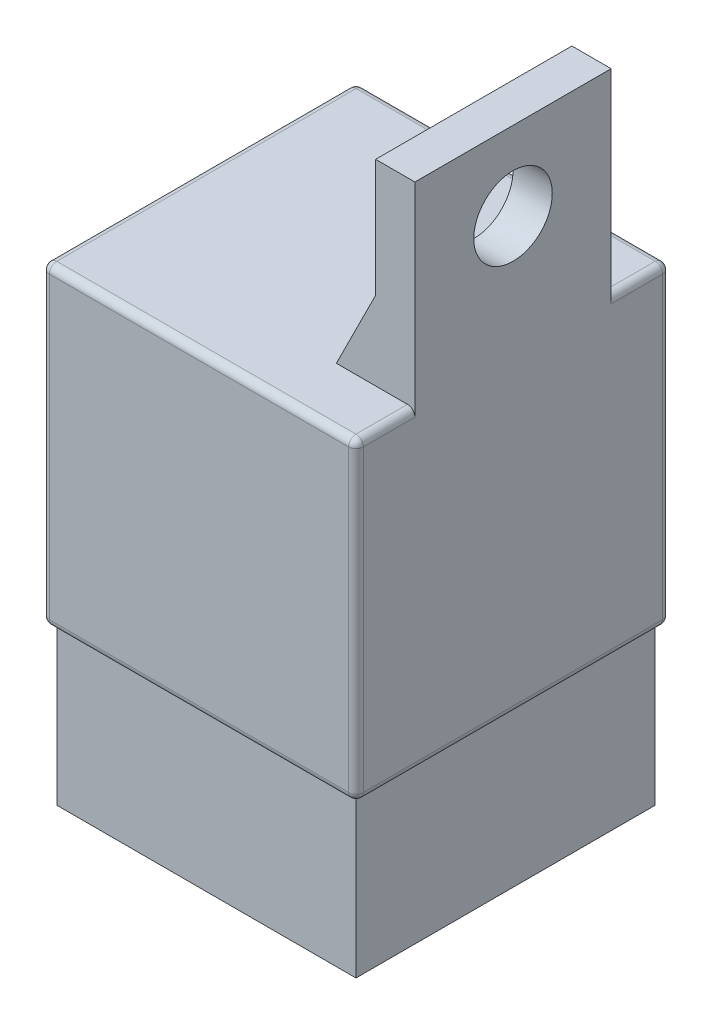
ISO-10303-21;
HEADER;
FILE_DESCRIPTION(('STEP AP214'),'2;1');
FILE_NAME('part.step','',(''),(''),'','','');
FILE_SCHEMA(('AUTOMOTIVE_DESIGN { 1 0 10303 214 1 1 1 1 }'));
ENDSEC;
DATA;
#1=APPLICATION_CONTEXT('core data for automotive mechanical design processes');
#2=APPLICATION_PROTOCOL_DEFINITION('international standard','automotive_design',2000,#1);
#3=PRODUCT_CONTEXT('',#1,'mechanical');
#4=PRODUCT('Part','Part','',(#3));
#5=PRODUCT_RELATED_PRODUCT_CATEGORY('part','',(#4));
#6=PRODUCT_DEFINITION_FORMATION('','',#4);
#7=PRODUCT_DEFINITION_CONTEXT('part definition',#1,'design');
#8=PRODUCT_DEFINITION('design','',#6,#7);
#9=PRODUCT_DEFINITION_SHAPE('','',#8);
#10=(LENGTH_UNIT() NAMED_UNIT(*) SI_UNIT(.MILLI.,.METRE.));
#11=(NAMED_UNIT(*) PLANE_ANGLE_UNIT() SI_UNIT($,.RADIAN.));
#12=(NAMED_UNIT(*) SI_UNIT($,.STERADIAN.) SOLID_ANGLE_UNIT());
#13=UNCERTAINTY_MEASURE_WITH_UNIT(LENGTH_MEASURE(1.E-05),#10,'distance_accuracy_value','');
#14=(GEOMETRIC_REPRESENTATION_CONTEXT(3) GLOBAL_UNCERTAINTY_ASSIGNED_CONTEXT((#13)) GLOBAL_UNIT_ASSIGNED_CONTEXT((#10,
#11,#12)) REPRESENTATION_CONTEXT('',''));
#15=CARTESIAN_POINT('',(0.,0.,0.));
#16=DIRECTION('',(0.,0.,1.));
#17=DIRECTION('',(1.,0.,0.));
#18=AXIS2_PLACEMENT_3D('',#15,#16,#17);
#19=CARTESIAN_POINT('',(-3.17500000000001,41.275,20.6375));
#20=DIRECTION('',(1.,0.,0.));
#21=DIRECTION('',(0.,1.,0.));
#22=AXIS2_PLACEMENT_3D('',#19,#20,#21);
#23=PLANE('',#22);
#24=CARTESIAN_POINT('',(-3.17500000000001,34.925,12.7));
#25=DIRECTION('',(-1.,0.,0.));
#26=DIRECTION('',(0.,-1.,0.));
#27=AXIS2_PLACEMENT_3D('',#24,#25,#26);
#28=CIRCLE('',#27,3.175);
#29=CARTESIAN_POINT('',(-3.17500000000001,31.75,12.7));
#30=VERTEX_POINT('',#29);
#31=EDGE_CURVE('E224',#30,#30,#28,.T.);
#32=ORIENTED_EDGE('',*,*,#31,.F.);
#33=EDGE_LOOP('',(#32));
#34=FACE_BOUND('',#33,.T.);
#35=DIRECTION('',(0.,0.,-1.));
#36=VECTOR('',#35,1.);
#37=CARTESIAN_POINT('',(-3.17500000000001,31.75,7.3025));
#38=LINE('',#37,#36);
#39=CARTESIAN_POINT('',(-3.17500000000001,31.75,7.3025));
#40=VERTEX_POINT('',#39);
#41=CARTESIAN_POINT('',(-3.17500000000001,31.75,4.7625));
#42=VERTEX_POINT('',#41);
#43=EDGE_CURVE('E241',#40,#42,#38,.T.);
#44=ORIENTED_EDGE('',*,*,#43,.F.);
#45=DIRECTION('',(0.,1.,0.));
#46=VECTOR('',#45,1.);
#47=CARTESIAN_POINT('',(-3.17500000000001,31.75,7.3025));
#48=LINE('',#47,#46);
#49=CARTESIAN_POINT('',(-3.17500000000001,25.4,7.3025));
#50=VERTEX_POINT('',#49);
#51=EDGE_CURVE('E228',#50,#40,#48,.T.);
#52=ORIENTED_EDGE('',*,*,#51,.F.);
#53=DIRECTION('',(0.,0.,1.));
#54=VECTOR('',#53,1.);
#55=CARTESIAN_POINT('',(-3.17500000000001,25.4,20.6375));
#56=LINE('',#55,#54);
#57=CARTESIAN_POINT('',(-3.17500000000001,25.4,18.0975));
#58=VERTEX_POINT('',#57);
#59=EDGE_CURVE('E275',#50,#58,#56,.T.);
#60=ORIENTED_EDGE('',*,*,#59,.T.);
#61=DIRECTION('',(0.,1.,0.));
#62=VECTOR('',#61,1.);
#63=CARTESIAN_POINT('',(-3.17500000000001,31.75,18.0975));
#64=LINE('',#63,#62);
#65=CARTESIAN_POINT('',(-3.17500000000001,31.75,18.0975));
#66=VERTEX_POINT('',#65);
#67=EDGE_CURVE('E247',#58,#66,#64,.T.);
#68=ORIENTED_EDGE('',*,*,#67,.T.);
#69=DIRECTION('',(0.,0.,1.));
#70=VECTOR('',#69,1.);
#71=CARTESIAN_POINT('',(-3.17500000000001,31.75,18.0975));
#72=LINE('',#71,#70);
#73=CARTESIAN_POINT('',(-3.17500000000001,31.75,20.6375));
#74=VERTEX_POINT('',#73);
#75=EDGE_CURVE('E255',#66,#74,#72,.T.);
#76=ORIENTED_EDGE('',*,*,#75,.T.);
#77=DIRECTION('',(0.,-1.,0.));
#78=VECTOR('',#77,1.);
#79=CARTESIAN_POINT('',(-3.17500000000001,41.275,20.6375));
#80=LINE('',#79,#78);
#81=CARTESIAN_POINT('',(-3.17500000000001,41.275,20.6375));
#82=VERTEX_POINT('',#81);
#83=EDGE_CURVE('E279',#82,#74,#80,.T.);
#84=ORIENTED_EDGE('',*,*,#83,.F.);
#85=DIRECTION('',(0.,0.,1.));
#86=VECTOR('',#85,1.);
#87=CARTESIAN_POINT('',(-3.17500000000001,41.275,20.6375));
#88=LINE('',#87,#86);
#89=CARTESIAN_POINT('',(-3.17500000000001,41.275,4.7625));
#90=VERTEX_POINT('',#89);
#91=EDGE_CURVE('E270',#90,#82,#88,.T.);
#92=ORIENTED_EDGE('',*,*,#91,.F.);
#93=DIRECTION('',(0.,-1.,0.));
#94=VECTOR('',#93,1.);
#95=CARTESIAN_POINT('',(-3.17500000000001,41.275,4.7625));
#96=LINE('',#95,#94);
#97=EDGE_CURVE('E307',#90,#42,#96,.T.);
#98=ORIENTED_EDGE('',*,*,#97,.T.);
#99=EDGE_LOOP('',(#44,#52,#60,#68,#76,#84,#92,#98));
#100=FACE_BOUND('',#99,.T.);
#101=ADVANCED_FACE('F33',(#34,#100),#23,.F.);
#102=CARTESIAN_POINT('',(0.,25.4,25.4));
#103=DIRECTION('',(0.,-1.,0.));
#104=DIRECTION('',(1.,0.,0.));
#105=AXIS2_PLACEMENT_3D('',#102,#103,#104);
#106=PLANE('',#105);
#107=DIRECTION('',(-1.,0.,0.));
#108=VECTOR('',#107,1.);
#109=CARTESIAN_POINT('',(0.,25.4,24.8));
#110=LINE('',#109,#108);
#111=CARTESIAN_POINT('',(-24.8,25.4,24.8));
#112=VERTEX_POINT('',#111);
#113=CARTESIAN_POINT('',(-0.6,25.4,24.8));
#114=VERTEX_POINT('',#113);
#115=EDGE_CURVE('E560',#112,#114,#110,.F.);
#116=ORIENTED_EDGE('',*,*,#115,.T.);
#117=DIRECTION('',(0.,0.,-1.));
#118=VECTOR('',#117,1.);
#119=CARTESIAN_POINT('',(-0.6,25.4,25.4));
#120=LINE('',#119,#118);
#121=CARTESIAN_POINT('',(-0.6,25.4,20.6375));
#122=VERTEX_POINT('',#121);
#123=EDGE_CURVE('E334',#114,#122,#120,.T.);
#124=ORIENTED_EDGE('',*,*,#123,.T.);
#125=DIRECTION('',(1.,0.,0.));
#126=VECTOR('',#125,1.);
#127=CARTESIAN_POINT('',(-3.17500000000001,25.4,20.6375));
#128=LINE('',#127,#126);
#129=CARTESIAN_POINT('',(-6.35000000000001,25.4,20.6375));
#130=VERTEX_POINT('',#129);
#131=EDGE_CURVE('E268',#130,#122,#128,.T.);
#132=ORIENTED_EDGE('',*,*,#131,.F.);
#133=DIRECTION('',(0.,0.,1.));
#134=VECTOR('',#133,1.);
#135=CARTESIAN_POINT('',(-6.35000000000001,25.4,18.0975));
#136=LINE('',#135,#134);
#137=CARTESIAN_POINT('',(-6.35000000000001,25.4,18.0975));
#138=VERTEX_POINT('',#137);
#139=EDGE_CURVE('E258',#138,#130,#136,.T.);
#140=ORIENTED_EDGE('',*,*,#139,.F.);
#141=DIRECTION('',(1.,0.,0.));
#142=VECTOR('',#141,1.);
#143=CARTESIAN_POINT('',(-3.17500000000001,25.4,18.0975));
#144=LINE('',#143,#142);
#145=EDGE_CURVE('E252',#138,#58,#144,.T.);
#146=ORIENTED_EDGE('',*,*,#145,.T.);
#147=ORIENTED_EDGE('',*,*,#59,.F.);
#148=DIRECTION('',(1.,0.,0.));
#149=VECTOR('',#148,1.);
#150=CARTESIAN_POINT('',(-3.17500000000001,25.4,7.3025));
#151=LINE('',#150,#149);
#152=CARTESIAN_POINT('',(-6.35000000000001,25.4,7.3025));
#153=VERTEX_POINT('',#152);
#154=EDGE_CURVE('E231',#153,#50,#151,.T.);
#155=ORIENTED_EDGE('',*,*,#154,.F.);
#156=DIRECTION('',(0.,0.,-1.));
#157=VECTOR('',#156,1.);
#158=CARTESIAN_POINT('',(-6.35000000000001,25.4,7.3025));
#159=LINE('',#158,#157);
#160=CARTESIAN_POINT('',(-6.35000000000001,25.4,4.7625));
#161=VERTEX_POINT('',#160);
#162=EDGE_CURVE('E238',#153,#161,#159,.T.);
#163=ORIENTED_EDGE('',*,*,#162,.T.);
#164=DIRECTION('',(-1.,0.,0.));
#165=VECTOR('',#164,1.);
#166=CARTESIAN_POINT('',(-3.17500000000001,25.4,4.7625));
#167=LINE('',#166,#165);
#168=CARTESIAN_POINT('',(-0.6,25.4,4.7625));
#169=VERTEX_POINT('',#168);
#170=EDGE_CURVE('E261',#169,#161,#167,.T.);
#171=ORIENTED_EDGE('',*,*,#170,.F.);
#172=DIRECTION('',(0.,0.,-1.));
#173=VECTOR('',#172,1.);
#174=CARTESIAN_POINT('',(-0.6,25.4,25.4));
#175=LINE('',#174,#173);
#176=CARTESIAN_POINT('',(-0.6,25.4,0.6));
#177=VERTEX_POINT('',#176);
#178=EDGE_CURVE('E302',#169,#177,#175,.T.);
#179=ORIENTED_EDGE('',*,*,#178,.T.);
#180=DIRECTION('',(-1.,0.,0.));
#181=VECTOR('',#180,1.);
#182=CARTESIAN_POINT('',(0.,25.4,0.6));
#183=LINE('',#182,#181);
#184=CARTESIAN_POINT('',(-24.8,25.4,0.6));
#185=VERTEX_POINT('',#184);
#186=EDGE_CURVE('E594',#177,#185,#183,.T.);
#187=ORIENTED_EDGE('',*,*,#186,.T.);
#188=DIRECTION('',(0.,0.,-1.));
#189=VECTOR('',#188,1.);
#190=CARTESIAN_POINT('',(-24.8,25.4,25.4));
#191=LINE('',#190,#189);
#192=EDGE_CURVE('E592',#185,#112,#191,.F.);
#193=ORIENTED_EDGE('',*,*,#192,.T.);
#194=EDGE_LOOP('',(#116,#124,#132,#140,#146,#147,#155,#163,#171,#179,#187,#193));
#195=FACE_BOUND('',#194,.T.);
#196=ADVANCED_FACE('F332',(#195),#106,.F.);
#197=CARTESIAN_POINT('',(0.,0.,25.4));
#198=DIRECTION('',(-1.,0.,0.));
#199=DIRECTION('',(0.,-1.,0.));
#200=AXIS2_PLACEMENT_3D('',#197,#198,#199);
#201=PLANE('',#200);
#202=CARTESIAN_POINT('',(0.,34.925,12.7));
#203=DIRECTION('',(-1.,0.,0.));
#204=DIRECTION('',(0.,-1.,0.));
#205=AXIS2_PLACEMENT_3D('',#202,#203,#204);
#206=CIRCLE('',#205,3.175);
#207=CARTESIAN_POINT('',(0.,31.75,12.7));
#208=VERTEX_POINT('',#207);
#209=EDGE_CURVE('E227',#208,#208,#206,.T.);
#210=ORIENTED_EDGE('',*,*,#209,.T.);
#211=EDGE_LOOP('',(#210));
#212=FACE_BOUND('',#211,.T.);
#213=DIRECTION('',(0.,-1.,0.));
#214=VECTOR('',#213,1.);
#215=CARTESIAN_POINT('',(0.,41.275,20.6375));
#216=LINE('',#215,#214);
#217=CARTESIAN_POINT('',(0.,41.275,20.6375));
#218=VERTEX_POINT('',#217);
#219=CARTESIAN_POINT('',(0.,24.8,20.6375));
#220=VERTEX_POINT('',#219);
#221=EDGE_CURVE('E274',#218,#220,#216,.T.);
#222=ORIENTED_EDGE('',*,*,#221,.T.);
#223=DIRECTION('',(0.,0.,-1.));
#224=VECTOR('',#223,1.);
#225=CARTESIAN_POINT('',(0.,24.8,25.4));
#226=LINE('',#225,#224);
#227=CARTESIAN_POINT('',(0.,24.8,24.8));
#228=VERTEX_POINT('',#227);
#229=EDGE_CURVE('E341',#220,#228,#226,.F.);
#230=ORIENTED_EDGE('',*,*,#229,.T.);
#231=DIRECTION('',(0.,1.,0.));
#232=VECTOR('',#231,1.);
#233=CARTESIAN_POINT('',(0.,0.,24.8));
#234=LINE('',#233,#232);
#235=CARTESIAN_POINT('',(0.,0.6,24.8));
#236=VERTEX_POINT('',#235);
#237=EDGE_CURVE('E565',#228,#236,#234,.F.);
#238=ORIENTED_EDGE('',*,*,#237,.T.);
#239=DIRECTION('',(0.,0.,-1.));
#240=VECTOR('',#239,1.);
#241=CARTESIAN_POINT('',(0.,0.6,25.4));
#242=LINE('',#241,#240);
#243=CARTESIAN_POINT('',(0.,0.6,0.6));
#244=VERTEX_POINT('',#243);
#245=EDGE_CURVE('E416',#236,#244,#242,.T.);
#246=ORIENTED_EDGE('',*,*,#245,.T.);
#247=DIRECTION('',(0.,1.,0.));
#248=VECTOR('',#247,1.);
#249=CARTESIAN_POINT('',(0.,0.,0.6));
#250=LINE('',#249,#248);
#251=CARTESIAN_POINT('',(0.,24.8,0.6));
#252=VERTEX_POINT('',#251);
#253=EDGE_CURVE('E547',#244,#252,#250,.T.);
#254=ORIENTED_EDGE('',*,*,#253,.T.);
#255=DIRECTION('',(0.,0.,-1.));
#256=VECTOR('',#255,1.);
#257=CARTESIAN_POINT('',(0.,24.8,25.4));
#258=LINE('',#257,#256);
#259=CARTESIAN_POINT('',(0.,24.8,4.7625));
#260=VERTEX_POINT('',#259);
#261=EDGE_CURVE('E556',#252,#260,#258,.F.);
#262=ORIENTED_EDGE('',*,*,#261,.T.);
#263=DIRECTION('',(0.,-1.,0.));
#264=VECTOR('',#263,1.);
#265=CARTESIAN_POINT('',(0.,41.275,4.7625));
#266=LINE('',#265,#264);
#267=CARTESIAN_POINT('',(0.,41.275,4.7625));
#268=VERTEX_POINT('',#267);
#269=EDGE_CURVE('E295',#268,#260,#266,.T.);
#270=ORIENTED_EDGE('',*,*,#269,.F.);
#271=DIRECTION('',(0.,0.,-1.));
#272=VECTOR('',#271,1.);
#273=CARTESIAN_POINT('',(0.,41.275,20.6375));
#274=LINE('',#273,#272);
#275=EDGE_CURVE('E264',#218,#268,#274,.T.);
#276=ORIENTED_EDGE('',*,*,#275,.F.);
#277=EDGE_LOOP('',(#222,#230,#238,#246,#254,#262,#270,#276));
#278=FACE_BOUND('',#277,.T.);
#279=ADVANCED_FACE('F448',(#212,#278),#201,.F.);
#280=CARTESIAN_POINT('',(-25.4,0.,25.4));
#281=DIRECTION('',(1.,0.,0.));
#282=DIRECTION('',(0.,0.,-1.));
#283=AXIS2_PLACEMENT_3D('',#280,#281,#282);
#284=PLANE('',#283);
#285=DIRECTION('',(0.,-1.,0.));
#286=VECTOR('',#285,1.);
#287=CARTESIAN_POINT('',(-25.4,25.4,24.8));
#288=LINE('',#287,#286);
#289=CARTESIAN_POINT('',(-25.4,0.6,24.8));
#290=VERTEX_POINT('',#289);
#291=CARTESIAN_POINT('',(-25.4,24.8,24.8));
#292=VERTEX_POINT('',#291);
#293=EDGE_CURVE('E572',#290,#292,#288,.F.);
#294=ORIENTED_EDGE('',*,*,#293,.T.);
#295=DIRECTION('',(0.,0.,-1.));
#296=VECTOR('',#295,1.);
#297=CARTESIAN_POINT('',(-25.4,24.8,25.4));
#298=LINE('',#297,#296);
#299=CARTESIAN_POINT('',(-25.4,24.8,0.6));
#300=VERTEX_POINT('',#299);
#301=EDGE_CURVE('E574',#292,#300,#298,.T.);
#302=ORIENTED_EDGE('',*,*,#301,.T.);
#303=DIRECTION('',(0.,-1.,0.));
#304=VECTOR('',#303,1.);
#305=CARTESIAN_POINT('',(-25.4,0.,0.6));
#306=LINE('',#305,#304);
#307=CARTESIAN_POINT('',(-25.4,0.6,0.6));
#308=VERTEX_POINT('',#307);
#309=EDGE_CURVE('E570',#300,#308,#306,.T.);
#310=ORIENTED_EDGE('',*,*,#309,.T.);
#311=DIRECTION('',(0.,0.,-1.));
#312=VECTOR('',#311,1.);
#313=CARTESIAN_POINT('',(-25.4,0.6,25.4));
#314=LINE('',#313,#312);
#315=EDGE_CURVE('E568',#308,#290,#314,.F.);
#316=ORIENTED_EDGE('',*,*,#315,.T.);
#317=EDGE_LOOP('',(#294,#302,#310,#316));
#318=FACE_BOUND('',#317,.T.);
#319=ADVANCED_FACE('F461',(#318),#284,.F.);
#320=CARTESIAN_POINT('',(0.,0.,25.4));
#321=DIRECTION('',(0.,0.,1.));
#322=DIRECTION('',(1.,0.,0.));
#323=AXIS2_PLACEMENT_3D('',#320,#321,#322);
#324=PLANE('',#323);
#325=DIRECTION('',(0.,1.,0.));
#326=VECTOR('',#325,1.);
#327=CARTESIAN_POINT('',(-0.6,25.4,25.4));
#328=LINE('',#327,#326);
#329=CARTESIAN_POINT('',(-0.6,0.6,25.4));
#330=VERTEX_POINT('',#329);
#331=CARTESIAN_POINT('',(-0.6,24.8,25.4));
#332=VERTEX_POINT('',#331);
#333=EDGE_CURVE('E297',#330,#332,#328,.T.);
#334=ORIENTED_EDGE('',*,*,#333,.T.);
#335=DIRECTION('',(-1.,0.,0.));
#336=VECTOR('',#335,1.);
#337=CARTESIAN_POINT('',(-25.4,24.8,25.4));
#338=LINE('',#337,#336);
#339=CARTESIAN_POINT('',(-24.8,24.8,25.4));
#340=VERTEX_POINT('',#339);
#341=EDGE_CURVE('E299',#332,#340,#338,.T.);
#342=ORIENTED_EDGE('',*,*,#341,.T.);
#343=DIRECTION('',(0.,-1.,0.));
#344=VECTOR('',#343,1.);
#345=CARTESIAN_POINT('',(-24.8,0.,25.4));
#346=LINE('',#345,#344);
#347=CARTESIAN_POINT('',(-24.8,0.6,25.4));
#348=VERTEX_POINT('',#347);
#349=EDGE_CURVE('E294',#340,#348,#346,.T.);
#350=ORIENTED_EDGE('',*,*,#349,.T.);
#351=DIRECTION('',(1.,0.,0.));
#352=VECTOR('',#351,1.);
#353=CARTESIAN_POINT('',(0.,0.6,25.4));
#354=LINE('',#353,#352);
#355=EDGE_CURVE('E292',#348,#330,#354,.T.);
#356=ORIENTED_EDGE('',*,*,#355,.T.);
#357=EDGE_LOOP('',(#334,#342,#350,#356));
#358=FACE_BOUND('',#357,.T.);
#359=ADVANCED_FACE('F458',(#358),#324,.T.);
#360=CARTESIAN_POINT('',(0.,0.,0.));
#361=DIRECTION('',(0.,0.,1.));
#362=DIRECTION('',(1.,0.,0.));
#363=AXIS2_PLACEMENT_3D('',#360,#361,#362);
#364=PLANE('',#363);
#365=DIRECTION('',(0.,-1.,0.));
#366=VECTOR('',#365,1.);
#367=CARTESIAN_POINT('',(-24.8,0.,0.));
#368=LINE('',#367,#366);
#369=CARTESIAN_POINT('',(-24.8,0.6,0.));
#370=VERTEX_POINT('',#369);
#371=CARTESIAN_POINT('',(-24.8,24.8,0.));
#372=VERTEX_POINT('',#371);
#373=EDGE_CURVE('E580',#370,#372,#368,.F.);
#374=ORIENTED_EDGE('',*,*,#373,.T.);
#375=DIRECTION('',(-1.,0.,0.));
#376=VECTOR('',#375,1.);
#377=CARTESIAN_POINT('',(0.,24.8,0.));
#378=LINE('',#377,#376);
#379=CARTESIAN_POINT('',(-0.6,24.8,0.));
#380=VERTEX_POINT('',#379);
#381=EDGE_CURVE('E427',#372,#380,#378,.F.);
#382=ORIENTED_EDGE('',*,*,#381,.T.);
#383=DIRECTION('',(0.,1.,0.));
#384=VECTOR('',#383,1.);
#385=CARTESIAN_POINT('',(-0.6,0.,0.));
#386=LINE('',#385,#384);
#387=CARTESIAN_POINT('',(-0.6,0.6,0.));
#388=VERTEX_POINT('',#387);
#389=EDGE_CURVE('E548',#380,#388,#386,.F.);
#390=ORIENTED_EDGE('',*,*,#389,.T.);
#391=DIRECTION('',(1.,0.,0.));
#392=VECTOR('',#391,1.);
#393=CARTESIAN_POINT('',(0.,0.6,0.));
#394=LINE('',#393,#392);
#395=EDGE_CURVE('E577',#388,#370,#394,.F.);
#396=ORIENTED_EDGE('',*,*,#395,.T.);
#397=EDGE_LOOP('',(#374,#382,#390,#396));
#398=FACE_BOUND('',#397,.T.);
#399=ADVANCED_FACE('F457',(#398),#364,.F.);
#400=CARTESIAN_POINT('',(-3.17500000000001,41.275,4.7625));
#401=DIRECTION('',(0.,0.,1.));
#402=DIRECTION('',(1.,0.,0.));
#403=AXIS2_PLACEMENT_3D('',#400,#401,#402);
#404=PLANE('',#403);
#405=ORIENTED_EDGE('',*,*,#269,.T.);
#406=CARTESIAN_POINT('',(-0.6,24.8,4.7625));
#407=DIRECTION('',(0.,0.,1.));
#408=DIRECTION('',(1.,0.,0.));
#409=AXIS2_PLACEMENT_3D('',#406,#407,#408);
#410=CIRCLE('',#409,0.6);
#411=EDGE_CURVE('E11',#260,#169,#410,.T.);
#412=ORIENTED_EDGE('',*,*,#411,.T.);
#413=ORIENTED_EDGE('',*,*,#170,.T.);
#414=DIRECTION('',(-0.447213595499958,-0.894427190999916,0.));
#415=VECTOR('',#414,1.);
#416=CARTESIAN_POINT('',(-6.35000000000001,25.4,4.7625));
#417=LINE('',#416,#415);
#418=EDGE_CURVE('E232',#42,#161,#417,.T.);
#419=ORIENTED_EDGE('',*,*,#418,.F.);
#420=ORIENTED_EDGE('',*,*,#97,.F.);
#421=DIRECTION('',(-1.,0.,0.));
#422=VECTOR('',#421,1.);
#423=CARTESIAN_POINT('',(-3.17500000000001,41.275,4.7625));
#424=LINE('',#423,#422);
#425=EDGE_CURVE('E267',#268,#90,#424,.T.);
#426=ORIENTED_EDGE('',*,*,#425,.F.);
#427=EDGE_LOOP('',(#405,#412,#413,#419,#420,#426));
#428=FACE_BOUND('',#427,.T.);
#429=ADVANCED_FACE('F454',(#428),#404,.F.);
#430=CARTESIAN_POINT('',(-3.17500000000001,41.275,20.6375));
#431=DIRECTION('',(0.,0.,-1.));
#432=DIRECTION('',(-1.,0.,0.));
#433=AXIS2_PLACEMENT_3D('',#430,#431,#432);
#434=PLANE('',#433);
#435=ORIENTED_EDGE('',*,*,#131,.T.);
#436=CARTESIAN_POINT('',(-0.6,24.8,20.6375));
#437=DIRECTION('',(0.,0.,-1.));
#438=DIRECTION('',(-1.,0.,0.));
#439=AXIS2_PLACEMENT_3D('',#436,#437,#438);
#440=CIRCLE('',#439,0.6);
#441=EDGE_CURVE('E42',#122,#220,#440,.T.);
#442=ORIENTED_EDGE('',*,*,#441,.T.);
#443=ORIENTED_EDGE('',*,*,#221,.F.);
#444=DIRECTION('',(1.,0.,0.));
#445=VECTOR('',#444,1.);
#446=CARTESIAN_POINT('',(-3.17500000000001,41.275,20.6375));
#447=LINE('',#446,#445);
#448=EDGE_CURVE('E272',#82,#218,#447,.T.);
#449=ORIENTED_EDGE('',*,*,#448,.F.);
#450=ORIENTED_EDGE('',*,*,#83,.T.);
#451=DIRECTION('',(-0.447213595499958,-0.894427190999916,0.));
#452=VECTOR('',#451,1.);
#453=CARTESIAN_POINT('',(-6.35000000000001,25.4,20.6375));
#454=LINE('',#453,#452);
#455=EDGE_CURVE('E244',#74,#130,#454,.T.);
#456=ORIENTED_EDGE('',*,*,#455,.T.);
#457=EDGE_LOOP('',(#435,#442,#443,#449,#450,#456));
#458=FACE_BOUND('',#457,.T.);
#459=ADVANCED_FACE('F319',(#458),#434,.F.);
#460=CARTESIAN_POINT('',(0.,41.275,0.));
#461=DIRECTION('',(0.,-1.,0.));
#462=DIRECTION('',(0.,0.,-1.));
#463=AXIS2_PLACEMENT_3D('',#460,#461,#462);
#464=PLANE('',#463);
#465=ORIENTED_EDGE('',*,*,#275,.T.);
#466=ORIENTED_EDGE('',*,*,#425,.T.);
#467=ORIENTED_EDGE('',*,*,#91,.T.);
#468=ORIENTED_EDGE('',*,*,#448,.T.);
#469=EDGE_LOOP('',(#465,#466,#467,#468));
#470=FACE_BOUND('',#469,.T.);
#471=ADVANCED_FACE('F617',(#470),#464,.F.);
#472=CARTESIAN_POINT('',(-6.35000000000001,25.4,18.0975));
#473=DIRECTION('',(-0.894427190999916,0.447213595499958,0.));
#474=DIRECTION('',(-0.447213595499958,-0.894427190999916,0.));
#475=AXIS2_PLACEMENT_3D('',#472,#473,#474);
#476=PLANE('',#475);
#477=ORIENTED_EDGE('',*,*,#455,.F.);
#478=ORIENTED_EDGE('',*,*,#75,.F.);
#479=DIRECTION('',(-0.447213595499958,-0.894427190999916,0.));
#480=VECTOR('',#479,1.);
#481=CARTESIAN_POINT('',(-6.35000000000001,25.4,18.0975));
#482=LINE('',#481,#480);
#483=EDGE_CURVE('E250',#66,#138,#482,.T.);
#484=ORIENTED_EDGE('',*,*,#483,.T.);
#485=ORIENTED_EDGE('',*,*,#139,.T.);
#486=EDGE_LOOP('',(#477,#478,#484,#485));
#487=FACE_BOUND('',#486,.T.);
#488=ADVANCED_FACE('F324',(#487),#476,.T.);
#489=CARTESIAN_POINT('',(0.,0.,18.0975));
#490=DIRECTION('',(0.,0.,-1.));
#491=DIRECTION('',(-1.,0.,0.));
#492=AXIS2_PLACEMENT_3D('',#489,#490,#491);
#493=PLANE('',#492);
#494=ORIENTED_EDGE('',*,*,#67,.F.);
#495=ORIENTED_EDGE('',*,*,#145,.F.);
#496=ORIENTED_EDGE('',*,*,#483,.F.);
#497=EDGE_LOOP('',(#494,#495,#496));
#498=FACE_BOUND('',#497,.T.);
#499=ADVANCED_FACE('F327',(#498),#493,.T.);
#500=CARTESIAN_POINT('',(-6.35000000000001,25.4,7.3025));
#501=DIRECTION('',(0.894427190999916,-0.447213595499958,0.));
#502=DIRECTION('',(0.447213595499958,0.894427190999916,0.));
#503=AXIS2_PLACEMENT_3D('',#500,#501,#502);
#504=PLANE('',#503);
#505=ORIENTED_EDGE('',*,*,#418,.T.);
#506=ORIENTED_EDGE('',*,*,#162,.F.);
#507=DIRECTION('',(-0.447213595499958,-0.894427190999916,0.));
#508=VECTOR('',#507,1.);
#509=CARTESIAN_POINT('',(-6.35000000000001,25.4,7.3025));
#510=LINE('',#509,#508);
#511=EDGE_CURVE('E235',#40,#153,#510,.T.);
#512=ORIENTED_EDGE('',*,*,#511,.F.);
#513=ORIENTED_EDGE('',*,*,#43,.T.);
#514=EDGE_LOOP('',(#505,#506,#512,#513));
#515=FACE_BOUND('',#514,.T.);
#516=ADVANCED_FACE('F600',(#515),#504,.F.);
#517=CARTESIAN_POINT('',(0.,0.,7.3025));
#518=DIRECTION('',(0.,0.,1.));
#519=DIRECTION('',(-1.,0.,0.));
#520=AXIS2_PLACEMENT_3D('',#517,#518,#519);
#521=PLANE('',#520);
#522=ORIENTED_EDGE('',*,*,#51,.T.);
#523=ORIENTED_EDGE('',*,*,#511,.T.);
#524=ORIENTED_EDGE('',*,*,#154,.T.);
#525=EDGE_LOOP('',(#522,#523,#524));
#526=FACE_BOUND('',#525,.T.);
#527=ADVANCED_FACE('F602',(#526),#521,.T.);
#528=CARTESIAN_POINT('',(5.00000000010041E-05,34.925,12.7));
#529=DIRECTION('',(-1.,0.,0.));
#530=DIRECTION('',(0.,-1.,0.));
#531=AXIS2_PLACEMENT_3D('',#528,#529,#530);
#532=CYLINDRICAL_SURFACE('',#531,3.175);
#533=ORIENTED_EDGE('',*,*,#31,.T.);
#534=EDGE_LOOP('',(#533));
#535=FACE_BOUND('',#534,.T.);
#536=ORIENTED_EDGE('',*,*,#209,.F.);
#537=EDGE_LOOP('',(#536));
#538=FACE_BOUND('',#537,.T.);
#539=ADVANCED_FACE('F545',(#535,#538),#532,.F.);
#540=CARTESIAN_POINT('',(0.,0.6,0.6));
#541=DIRECTION('',(1.,0.,0.));
#542=DIRECTION('',(0.,0.,-1.));
#543=AXIS2_PLACEMENT_3D('',#540,#541,#542);
#544=CYLINDRICAL_SURFACE('',#543,0.6);
#545=CARTESIAN_POINT('',(-24.8,0.6,0.6));
#546=DIRECTION('',(-1.,0.,0.));
#547=DIRECTION('',(0.,0.,1.));
#548=AXIS2_PLACEMENT_3D('',#545,#546,#547);
#549=CIRCLE('',#548,0.6);
#550=CARTESIAN_POINT('',(-24.8,0.,0.6));
#551=VERTEX_POINT('',#550);
#552=EDGE_CURVE('E401',#370,#551,#549,.T.);
#553=ORIENTED_EDGE('',*,*,#552,.F.);
#554=ORIENTED_EDGE('',*,*,#395,.F.);
#555=CARTESIAN_POINT('',(-0.6,0.6,0.6));
#556=DIRECTION('',(1.,0.,0.));
#557=DIRECTION('',(0.,0.,-1.));
#558=AXIS2_PLACEMENT_3D('',#555,#556,#557);
#559=CIRCLE('',#558,0.6);
#560=CARTESIAN_POINT('',(-0.6,0.,0.6));
#561=VERTEX_POINT('',#560);
#562=EDGE_CURVE('E403',#561,#388,#559,.T.);
#563=ORIENTED_EDGE('',*,*,#562,.F.);
#564=DIRECTION('',(1.,0.,0.));
#565=VECTOR('',#564,1.);
#566=CARTESIAN_POINT('',(0.,0.,0.6));
#567=LINE('',#566,#565);
#568=EDGE_CURVE('E418',#551,#561,#567,.T.);
#569=ORIENTED_EDGE('',*,*,#568,.F.);
#570=EDGE_LOOP('',(#553,#554,#563,#569));
#571=FACE_BOUND('',#570,.T.);
#572=ADVANCED_FACE('F35',(#571),#544,.T.);
#573=CARTESIAN_POINT('',(-0.6,0.,0.6));
#574=DIRECTION('',(0.,1.,0.));
#575=DIRECTION('',(-1.,0.,0.));
#576=AXIS2_PLACEMENT_3D('',#573,#574,#575);
#577=CYLINDRICAL_SURFACE('',#576,0.6);
#578=CARTESIAN_POINT('',(-0.6,24.8,0.6));
#579=DIRECTION('',(0.,1.,0.));
#580=DIRECTION('',(0.,0.,1.));
#581=AXIS2_PLACEMENT_3D('',#578,#579,#580);
#582=CIRCLE('',#581,0.6);
#583=EDGE_CURVE('E398',#252,#380,#582,.T.);
#584=ORIENTED_EDGE('',*,*,#583,.F.);
#585=ORIENTED_EDGE('',*,*,#253,.F.);
#586=CARTESIAN_POINT('',(-0.6,0.6,0.6));
#587=DIRECTION('',(0.,-1.,0.));
#588=DIRECTION('',(0.,0.,-1.));
#589=AXIS2_PLACEMENT_3D('',#586,#587,#588);
#590=CIRCLE('',#589,0.6);
#591=EDGE_CURVE('E37',#388,#244,#590,.T.);
#592=ORIENTED_EDGE('',*,*,#591,.F.);
#593=ORIENTED_EDGE('',*,*,#389,.F.);
#594=EDGE_LOOP('',(#584,#585,#592,#593));
#595=FACE_BOUND('',#594,.T.);
#596=ADVANCED_FACE('F538',(#595),#577,.T.);
#597=CARTESIAN_POINT('',(-0.6,24.8,25.4));
#598=DIRECTION('',(0.,0.,-1.));
#599=DIRECTION('',(-1.,0.,0.));
#600=AXIS2_PLACEMENT_3D('',#597,#598,#599);
#601=CYLINDRICAL_SURFACE('',#600,0.6);
#602=ORIENTED_EDGE('',*,*,#411,.F.);
#603=ORIENTED_EDGE('',*,*,#261,.F.);
#604=CARTESIAN_POINT('',(-0.6,24.8,0.6));
#605=DIRECTION('',(0.,0.,-1.));
#606=DIRECTION('',(-1.,0.,0.));
#607=AXIS2_PLACEMENT_3D('',#604,#605,#606);
#608=CIRCLE('',#607,0.6);
#609=EDGE_CURVE('E395',#177,#252,#608,.T.);
#610=ORIENTED_EDGE('',*,*,#609,.F.);
#611=ORIENTED_EDGE('',*,*,#178,.F.);
#612=EDGE_LOOP('',(#602,#603,#610,#611));
#613=FACE_BOUND('',#612,.T.);
#614=ADVANCED_FACE('F536',(#613),#601,.T.);
#615=CARTESIAN_POINT('',(-0.6,0.6,0.6));
#616=DIRECTION('',(0.,0.,1.));
#617=DIRECTION('',(1.,0.,0.));
#618=AXIS2_PLACEMENT_3D('',#615,#616,#617);
#619=SPHERICAL_SURFACE('',#618,0.6);
#620=ORIENTED_EDGE('',*,*,#562,.T.);
#621=ORIENTED_EDGE('',*,*,#591,.T.);
#622=CARTESIAN_POINT('',(-0.6,0.6,0.6));
#623=DIRECTION('',(0.,0.,-1.));
#624=DIRECTION('',(-1.,0.,0.));
#625=AXIS2_PLACEMENT_3D('',#622,#623,#624);
#626=CIRCLE('',#625,0.6);
#627=EDGE_CURVE('E392',#561,#244,#626,.F.);
#628=ORIENTED_EDGE('',*,*,#627,.F.);
#629=EDGE_LOOP('',(#620,#621,#628));
#630=FACE_BOUND('',#629,.T.);
#631=ADVANCED_FACE('F409',(#630),#619,.T.);
#632=CARTESIAN_POINT('',(-24.8,0.6,0.6));
#633=DIRECTION('',(0.,0.,1.));
#634=DIRECTION('',(1.,0.,0.));
#635=AXIS2_PLACEMENT_3D('',#632,#633,#634);
#636=SPHERICAL_SURFACE('',#635,0.6);
#637=CARTESIAN_POINT('',(-24.8,0.6,0.6));
#638=DIRECTION('',(0.,-1.,0.));
#639=DIRECTION('',(0.,0.,-1.));
#640=AXIS2_PLACEMENT_3D('',#637,#638,#639);
#641=CIRCLE('',#640,0.6);
#642=EDGE_CURVE('E387',#370,#308,#641,.F.);
#643=ORIENTED_EDGE('',*,*,#642,.F.);
#644=ORIENTED_EDGE('',*,*,#552,.T.);
#645=CARTESIAN_POINT('',(-24.8,0.6,0.6));
#646=DIRECTION('',(0.,0.,-1.));
#647=DIRECTION('',(-1.,0.,0.));
#648=AXIS2_PLACEMENT_3D('',#645,#646,#647);
#649=CIRCLE('',#648,0.6);
#650=EDGE_CURVE('E390',#308,#551,#649,.F.);
#651=ORIENTED_EDGE('',*,*,#650,.F.);
#652=EDGE_LOOP('',(#643,#644,#651));
#653=FACE_BOUND('',#652,.T.);
#654=ADVANCED_FACE('F529',(#653),#636,.T.);
#655=CARTESIAN_POINT('',(-0.6,24.8,0.6));
#656=DIRECTION('',(0.,0.,1.));
#657=DIRECTION('',(1.,0.,0.));
#658=AXIS2_PLACEMENT_3D('',#655,#656,#657);
#659=SPHERICAL_SURFACE('',#658,0.6);
#660=ORIENTED_EDGE('',*,*,#609,.T.);
#661=ORIENTED_EDGE('',*,*,#583,.T.);
#662=CARTESIAN_POINT('',(-0.6,24.8,0.6));
#663=DIRECTION('',(1.,0.,0.));
#664=DIRECTION('',(0.,1.,0.));
#665=AXIS2_PLACEMENT_3D('',#662,#663,#664);
#666=CIRCLE('',#665,0.6);
#667=EDGE_CURVE('E385',#177,#380,#666,.F.);
#668=ORIENTED_EDGE('',*,*,#667,.F.);
#669=EDGE_LOOP('',(#660,#661,#668));
#670=FACE_BOUND('',#669,.T.);
#671=ADVANCED_FACE('F526',(#670),#659,.T.);
#672=CARTESIAN_POINT('',(-0.6,0.6,25.4));
#673=DIRECTION('',(0.,0.,-1.));
#674=DIRECTION('',(-1.,0.,0.));
#675=AXIS2_PLACEMENT_3D('',#672,#673,#674);
#676=CYLINDRICAL_SURFACE('',#675,0.6);
#677=ORIENTED_EDGE('',*,*,#627,.T.);
#678=ORIENTED_EDGE('',*,*,#245,.F.);
#679=CARTESIAN_POINT('',(-0.6,0.6,24.8));
#680=DIRECTION('',(0.,0.,1.));
#681=DIRECTION('',(1.,0.,0.));
#682=AXIS2_PLACEMENT_3D('',#679,#680,#681);
#683=CIRCLE('',#682,0.6);
#684=CARTESIAN_POINT('',(-0.6,0.,24.8));
#685=VERTEX_POINT('',#684);
#686=EDGE_CURVE('E382',#685,#236,#683,.T.);
#687=ORIENTED_EDGE('',*,*,#686,.F.);
#688=DIRECTION('',(0.,0.,-1.));
#689=VECTOR('',#688,1.);
#690=CARTESIAN_POINT('',(-0.6,0.,25.4));
#691=LINE('',#690,#689);
#692=EDGE_CURVE('E215',#561,#685,#691,.F.);
#693=ORIENTED_EDGE('',*,*,#692,.F.);
#694=EDGE_LOOP('',(#677,#678,#687,#693));
#695=FACE_BOUND('',#694,.T.);
#696=ADVANCED_FACE('F415',(#695),#676,.T.);
#697=CARTESIAN_POINT('',(0.,0.6,24.8));
#698=DIRECTION('',(-1.,0.,0.));
#699=DIRECTION('',(0.,0.,1.));
#700=AXIS2_PLACEMENT_3D('',#697,#698,#699);
#701=CYLINDRICAL_SURFACE('',#700,0.6);
#702=CARTESIAN_POINT('',(-24.8,0.6,24.8));
#703=DIRECTION('',(-1.,0.,0.));
#704=DIRECTION('',(0.,0.,1.));
#705=AXIS2_PLACEMENT_3D('',#702,#703,#704);
#706=CIRCLE('',#705,0.6);
#707=CARTESIAN_POINT('',(-24.8,0.,24.8));
#708=VERTEX_POINT('',#707);
#709=EDGE_CURVE('E376',#708,#348,#706,.T.);
#710=ORIENTED_EDGE('',*,*,#709,.F.);
#711=DIRECTION('',(1.,0.,0.));
#712=VECTOR('',#711,1.);
#713=CARTESIAN_POINT('',(-25.4,0.,24.8));
#714=LINE('',#713,#712);
#715=EDGE_CURVE('E57',#685,#708,#714,.F.);
#716=ORIENTED_EDGE('',*,*,#715,.F.);
#717=CARTESIAN_POINT('',(-0.6,0.6,24.8));
#718=DIRECTION('',(1.,0.,0.));
#719=DIRECTION('',(0.,0.,-1.));
#720=AXIS2_PLACEMENT_3D('',#717,#718,#719);
#721=CIRCLE('',#720,0.6);
#722=EDGE_CURVE('E379',#330,#685,#721,.T.);
#723=ORIENTED_EDGE('',*,*,#722,.F.);
#724=ORIENTED_EDGE('',*,*,#355,.F.);
#725=EDGE_LOOP('',(#710,#716,#723,#724));
#726=FACE_BOUND('',#725,.T.);
#727=ADVANCED_FACE('F521',(#726),#701,.T.);
#728=CARTESIAN_POINT('',(-24.8,0.6,25.4));
#729=DIRECTION('',(0.,0.,-1.));
#730=DIRECTION('',(-1.,0.,0.));
#731=AXIS2_PLACEMENT_3D('',#728,#729,#730);
#732=CYLINDRICAL_SURFACE('',#731,0.6);
#733=ORIENTED_EDGE('',*,*,#650,.T.);
#734=DIRECTION('',(0.,0.,-1.));
#735=VECTOR('',#734,1.);
#736=CARTESIAN_POINT('',(-24.8,0.,25.4));
#737=LINE('',#736,#735);
#738=EDGE_CURVE('E50',#708,#551,#737,.T.);
#739=ORIENTED_EDGE('',*,*,#738,.F.);
#740=CARTESIAN_POINT('',(-24.8,0.6,24.8));
#741=DIRECTION('',(0.,0.,1.));
#742=DIRECTION('',(1.,0.,0.));
#743=AXIS2_PLACEMENT_3D('',#740,#741,#742);
#744=CIRCLE('',#743,0.6);
#745=EDGE_CURVE('E373',#290,#708,#744,.T.);
#746=ORIENTED_EDGE('',*,*,#745,.F.);
#747=ORIENTED_EDGE('',*,*,#315,.F.);
#748=EDGE_LOOP('',(#733,#739,#746,#747));
#749=FACE_BOUND('',#748,.T.);
#750=ADVANCED_FACE('F517',(#749),#732,.T.);
#751=CARTESIAN_POINT('',(-24.8,0.,0.6));
#752=DIRECTION('',(0.,-1.,0.));
#753=DIRECTION('',(0.,0.,-1.));
#754=AXIS2_PLACEMENT_3D('',#751,#752,#753);
#755=CYLINDRICAL_SURFACE('',#754,0.6);
#756=ORIENTED_EDGE('',*,*,#642,.T.);
#757=ORIENTED_EDGE('',*,*,#309,.F.);
#758=CARTESIAN_POINT('',(-24.8,24.8,0.6));
#759=DIRECTION('',(0.,1.,0.));
#760=DIRECTION('',(0.,0.,1.));
#761=AXIS2_PLACEMENT_3D('',#758,#759,#760);
#762=CIRCLE('',#761,0.6);
#763=EDGE_CURVE('E370',#372,#300,#762,.T.);
#764=ORIENTED_EDGE('',*,*,#763,.F.);
#765=ORIENTED_EDGE('',*,*,#373,.F.);
#766=EDGE_LOOP('',(#756,#757,#764,#765));
#767=FACE_BOUND('',#766,.T.);
#768=ADVANCED_FACE('F513',(#767),#755,.T.);
#769=CARTESIAN_POINT('',(0.,24.8,0.6));
#770=DIRECTION('',(-1.,0.,0.));
#771=DIRECTION('',(0.,-1.,0.));
#772=AXIS2_PLACEMENT_3D('',#769,#770,#771);
#773=CYLINDRICAL_SURFACE('',#772,0.6);
#774=ORIENTED_EDGE('',*,*,#667,.T.);
#775=ORIENTED_EDGE('',*,*,#381,.F.);
#776=CARTESIAN_POINT('',(-24.8,24.8,0.6));
#777=DIRECTION('',(-1.,0.,0.));
#778=DIRECTION('',(0.,0.,1.));
#779=AXIS2_PLACEMENT_3D('',#776,#777,#778);
#780=CIRCLE('',#779,0.6);
#781=EDGE_CURVE('E367',#185,#372,#780,.T.);
#782=ORIENTED_EDGE('',*,*,#781,.F.);
#783=ORIENTED_EDGE('',*,*,#186,.F.);
#784=EDGE_LOOP('',(#774,#775,#782,#783));
#785=FACE_BOUND('',#784,.T.);
#786=ADVANCED_FACE('F509',(#785),#773,.T.);
#787=CARTESIAN_POINT('',(-0.6,0.6,24.8));
#788=DIRECTION('',(0.,0.,1.));
#789=DIRECTION('',(1.,0.,0.));
#790=AXIS2_PLACEMENT_3D('',#787,#788,#789);
#791=SPHERICAL_SURFACE('',#790,0.6);
#792=ORIENTED_EDGE('',*,*,#722,.T.);
#793=ORIENTED_EDGE('',*,*,#686,.T.);
#794=CARTESIAN_POINT('',(-0.6,0.6,24.8));
#795=DIRECTION('',(0.,-1.,0.));
#796=DIRECTION('',(0.,0.,-1.));
#797=AXIS2_PLACEMENT_3D('',#794,#795,#796);
#798=CIRCLE('',#797,0.6);
#799=EDGE_CURVE('E364',#330,#236,#798,.F.);
#800=ORIENTED_EDGE('',*,*,#799,.F.);
#801=EDGE_LOOP('',(#792,#793,#800));
#802=FACE_BOUND('',#801,.T.);
#803=ADVANCED_FACE('F505',(#802),#791,.T.);
#804=CARTESIAN_POINT('',(-24.8,0.6,24.8));
#805=DIRECTION('',(0.,0.,1.));
#806=DIRECTION('',(1.,0.,0.));
#807=AXIS2_PLACEMENT_3D('',#804,#805,#806);
#808=SPHERICAL_SURFACE('',#807,0.6);
#809=ORIENTED_EDGE('',*,*,#745,.T.);
#810=ORIENTED_EDGE('',*,*,#709,.T.);
#811=CARTESIAN_POINT('',(-24.8,0.6,24.8));
#812=DIRECTION('',(0.,-1.,0.));
#813=DIRECTION('',(0.,0.,-1.));
#814=AXIS2_PLACEMENT_3D('',#811,#812,#813);
#815=CIRCLE('',#814,0.6);
#816=EDGE_CURVE('E361',#290,#348,#815,.F.);
#817=ORIENTED_EDGE('',*,*,#816,.F.);
#818=EDGE_LOOP('',(#809,#810,#817));
#819=FACE_BOUND('',#818,.T.);
#820=ADVANCED_FACE('F501',(#819),#808,.T.);
#821=CARTESIAN_POINT('',(-24.8,24.8,0.6));
#822=DIRECTION('',(0.,0.,1.));
#823=DIRECTION('',(1.,0.,0.));
#824=AXIS2_PLACEMENT_3D('',#821,#822,#823);
#825=SPHERICAL_SURFACE('',#824,0.6);
#826=ORIENTED_EDGE('',*,*,#781,.T.);
#827=ORIENTED_EDGE('',*,*,#763,.T.);
#828=CARTESIAN_POINT('',(-24.8,24.8,0.6));
#829=DIRECTION('',(0.,0.,-1.));
#830=DIRECTION('',(-1.,0.,0.));
#831=AXIS2_PLACEMENT_3D('',#828,#829,#830);
#832=CIRCLE('',#831,0.6);
#833=EDGE_CURVE('E359',#185,#300,#832,.F.);
#834=ORIENTED_EDGE('',*,*,#833,.F.);
#835=EDGE_LOOP('',(#826,#827,#834));
#836=FACE_BOUND('',#835,.T.);
#837=ADVANCED_FACE('F498',(#836),#825,.T.);
#838=CARTESIAN_POINT('',(-0.6,24.8,25.4));
#839=DIRECTION('',(0.,0.,-1.));
#840=DIRECTION('',(-1.,0.,0.));
#841=AXIS2_PLACEMENT_3D('',#838,#839,#840);
#842=CYLINDRICAL_SURFACE('',#841,0.6);
#843=ORIENTED_EDGE('',*,*,#441,.F.);
#844=ORIENTED_EDGE('',*,*,#123,.F.);
#845=CARTESIAN_POINT('',(-0.6,24.8,24.8));
#846=DIRECTION('',(0.,0.,1.));
#847=DIRECTION('',(1.,0.,0.));
#848=AXIS2_PLACEMENT_3D('',#845,#846,#847);
#849=CIRCLE('',#848,0.6);
#850=EDGE_CURVE('E356',#228,#114,#849,.T.);
#851=ORIENTED_EDGE('',*,*,#850,.F.);
#852=ORIENTED_EDGE('',*,*,#229,.F.);
#853=EDGE_LOOP('',(#843,#844,#851,#852));
#854=FACE_BOUND('',#853,.T.);
#855=ADVANCED_FACE('F339',(#854),#842,.T.);
#856=CARTESIAN_POINT('',(-0.6,0.,24.8));
#857=DIRECTION('',(0.,-1.,0.));
#858=DIRECTION('',(1.,0.,0.));
#859=AXIS2_PLACEMENT_3D('',#856,#857,#858);
#860=CYLINDRICAL_SURFACE('',#859,0.6);
#861=ORIENTED_EDGE('',*,*,#799,.T.);
#862=ORIENTED_EDGE('',*,*,#237,.F.);
#863=CARTESIAN_POINT('',(-0.6,24.8,24.8));
#864=DIRECTION('',(0.,1.,0.));
#865=DIRECTION('',(0.,0.,1.));
#866=AXIS2_PLACEMENT_3D('',#863,#864,#865);
#867=CIRCLE('',#866,0.6);
#868=EDGE_CURVE('E353',#332,#228,#867,.T.);
#869=ORIENTED_EDGE('',*,*,#868,.F.);
#870=ORIENTED_EDGE('',*,*,#333,.F.);
#871=EDGE_LOOP('',(#861,#862,#869,#870));
#872=FACE_BOUND('',#871,.T.);
#873=ADVANCED_FACE('F491',(#872),#860,.T.);
#874=CARTESIAN_POINT('',(-24.8,0.,24.8));
#875=DIRECTION('',(0.,1.,0.));
#876=DIRECTION('',(0.,0.,1.));
#877=AXIS2_PLACEMENT_3D('',#874,#875,#876);
#878=CYLINDRICAL_SURFACE('',#877,0.6);
#879=ORIENTED_EDGE('',*,*,#816,.T.);
#880=ORIENTED_EDGE('',*,*,#349,.F.);
#881=CARTESIAN_POINT('',(-24.8,24.8,24.8));
#882=DIRECTION('',(0.,1.,0.));
#883=DIRECTION('',(0.,0.,1.));
#884=AXIS2_PLACEMENT_3D('',#881,#882,#883);
#885=CIRCLE('',#884,0.6);
#886=EDGE_CURVE('E350',#292,#340,#885,.T.);
#887=ORIENTED_EDGE('',*,*,#886,.F.);
#888=ORIENTED_EDGE('',*,*,#293,.F.);
#889=EDGE_LOOP('',(#879,#880,#887,#888));
#890=FACE_BOUND('',#889,.T.);
#891=ADVANCED_FACE('F487',(#890),#878,.T.);
#892=CARTESIAN_POINT('',(-24.8,24.8,25.4));
#893=DIRECTION('',(0.,0.,-1.));
#894=DIRECTION('',(-1.,0.,0.));
#895=AXIS2_PLACEMENT_3D('',#892,#893,#894);
#896=CYLINDRICAL_SURFACE('',#895,0.6);
#897=ORIENTED_EDGE('',*,*,#833,.T.);
#898=ORIENTED_EDGE('',*,*,#301,.F.);
#899=CARTESIAN_POINT('',(-24.8,24.8,24.8));
#900=DIRECTION('',(0.,0.,1.));
#901=DIRECTION('',(1.,0.,0.));
#902=AXIS2_PLACEMENT_3D('',#899,#900,#901);
#903=CIRCLE('',#902,0.6);
#904=EDGE_CURVE('E347',#112,#292,#903,.T.);
#905=ORIENTED_EDGE('',*,*,#904,.F.);
#906=ORIENTED_EDGE('',*,*,#192,.F.);
#907=EDGE_LOOP('',(#897,#898,#905,#906));
#908=FACE_BOUND('',#907,.T.);
#909=ADVANCED_FACE('F483',(#908),#896,.T.);
#910=CARTESIAN_POINT('',(-0.6,24.8,24.8));
#911=DIRECTION('',(0.,0.,1.));
#912=DIRECTION('',(1.,0.,0.));
#913=AXIS2_PLACEMENT_3D('',#910,#911,#912);
#914=SPHERICAL_SURFACE('',#913,0.6);
#915=ORIENTED_EDGE('',*,*,#868,.T.);
#916=ORIENTED_EDGE('',*,*,#850,.T.);
#917=CARTESIAN_POINT('',(-0.6,24.8,24.8));
#918=DIRECTION('',(1.,0.,0.));
#919=DIRECTION('',(0.,1.,0.));
#920=AXIS2_PLACEMENT_3D('',#917,#918,#919);
#921=CIRCLE('',#920,0.6);
#922=EDGE_CURVE('E218',#332,#114,#921,.F.);
#923=ORIENTED_EDGE('',*,*,#922,.F.);
#924=EDGE_LOOP('',(#915,#916,#923));
#925=FACE_BOUND('',#924,.T.);
#926=ADVANCED_FACE('F479',(#925),#914,.T.);
#927=CARTESIAN_POINT('',(-24.8,24.8,24.8));
#928=DIRECTION('',(0.,0.,1.));
#929=DIRECTION('',(1.,0.,0.));
#930=AXIS2_PLACEMENT_3D('',#927,#928,#929);
#931=SPHERICAL_SURFACE('',#930,0.6);
#932=ORIENTED_EDGE('',*,*,#904,.T.);
#933=ORIENTED_EDGE('',*,*,#886,.T.);
#934=CARTESIAN_POINT('',(-24.8,24.8,24.8));
#935=DIRECTION('',(-1.,0.,0.));
#936=DIRECTION('',(0.,0.,1.));
#937=AXIS2_PLACEMENT_3D('',#934,#935,#936);
#938=CIRCLE('',#937,0.6);
#939=EDGE_CURVE('E216',#112,#340,#938,.F.);
#940=ORIENTED_EDGE('',*,*,#939,.F.);
#941=EDGE_LOOP('',(#932,#933,#940));
#942=FACE_BOUND('',#941,.T.);
#943=ADVANCED_FACE('F475',(#942),#931,.T.);
#944=CARTESIAN_POINT('',(0.,24.8,24.8));
#945=DIRECTION('',(1.,0.,0.));
#946=DIRECTION('',(0.,1.,0.));
#947=AXIS2_PLACEMENT_3D('',#944,#945,#946);
#948=CYLINDRICAL_SURFACE('',#947,0.6);
#949=ORIENTED_EDGE('',*,*,#922,.T.);
#950=ORIENTED_EDGE('',*,*,#115,.F.);
#951=ORIENTED_EDGE('',*,*,#939,.T.);
#952=ORIENTED_EDGE('',*,*,#341,.F.);
#953=EDGE_LOOP('',(#949,#950,#951,#952));
#954=FACE_BOUND('',#953,.T.);
#955=ADVANCED_FACE('F472',(#954),#948,.T.);
#956=CARTESIAN_POINT('',(-0.6,-12.7,0.6));
#957=DIRECTION('',(-1.,0.,0.));
#958=DIRECTION('',(0.,0.,1.));
#959=AXIS2_PLACEMENT_3D('',#956,#957,#958);
#960=PLANE('',#959);
#961=ORIENTED_EDGE('',*,*,#692,.T.);
#962=DIRECTION('',(0.,1.,0.));
#963=VECTOR('',#962,1.);
#964=CARTESIAN_POINT('',(-0.6,-12.7,24.8));
#965=LINE('',#964,#963);
#966=CARTESIAN_POINT('',(-0.6,-12.7,24.8));
#967=VERTEX_POINT('',#966);
#968=EDGE_CURVE('E196',#967,#685,#965,.T.);
#969=ORIENTED_EDGE('',*,*,#968,.F.);
#970=DIRECTION('',(0.,0.,1.));
#971=VECTOR('',#970,1.);
#972=CARTESIAN_POINT('',(-0.6,-12.7,0.6));
#973=LINE('',#972,#971);
#974=CARTESIAN_POINT('',(-0.6,-12.7,0.6));
#975=VERTEX_POINT('',#974);
#976=EDGE_CURVE('E203',#975,#967,#973,.T.);
#977=ORIENTED_EDGE('',*,*,#976,.F.);
#978=DIRECTION('',(0.,1.,0.));
#979=VECTOR('',#978,1.);
#980=CARTESIAN_POINT('',(-0.6,-12.7,0.6));
#981=LINE('',#980,#979);
#982=EDGE_CURVE('E423',#975,#561,#981,.T.);
#983=ORIENTED_EDGE('',*,*,#982,.T.);
#984=EDGE_LOOP('',(#961,#969,#977,#983));
#985=FACE_BOUND('',#984,.T.);
#986=ADVANCED_FACE('F213',(#985),#960,.F.);
#987=CARTESIAN_POINT('',(-0.6,-12.7,24.8));
#988=DIRECTION('',(0.,0.,-1.));
#989=DIRECTION('',(-1.,0.,0.));
#990=AXIS2_PLACEMENT_3D('',#987,#988,#989);
#991=PLANE('',#990);
#992=ORIENTED_EDGE('',*,*,#715,.T.);
#993=DIRECTION('',(0.,1.,0.));
#994=VECTOR('',#993,1.);
#995=CARTESIAN_POINT('',(-24.8,-12.7,24.8));
#996=LINE('',#995,#994);
#997=CARTESIAN_POINT('',(-24.8,-12.7,24.8));
#998=VERTEX_POINT('',#997);
#999=EDGE_CURVE('E199',#998,#708,#996,.T.);
#1000=ORIENTED_EDGE('',*,*,#999,.F.);
#1001=DIRECTION('',(-1.,0.,0.));
#1002=VECTOR('',#1001,1.);
#1003=CARTESIAN_POINT('',(-0.6,-12.7,24.8));
#1004=LINE('',#1003,#1002);
#1005=EDGE_CURVE('E192',#967,#998,#1004,.T.);
#1006=ORIENTED_EDGE('',*,*,#1005,.F.);
#1007=ORIENTED_EDGE('',*,*,#968,.T.);
#1008=EDGE_LOOP('',(#992,#1000,#1006,#1007));
#1009=FACE_BOUND('',#1008,.T.);
#1010=ADVANCED_FACE('F194',(#1009),#991,.F.);
#1011=CARTESIAN_POINT('',(-24.8,-12.7,24.8));
#1012=DIRECTION('',(1.,0.,0.));
#1013=DIRECTION('',(0.,0.,-1.));
#1014=AXIS2_PLACEMENT_3D('',#1011,#1012,#1013);
#1015=PLANE('',#1014);
#1016=ORIENTED_EDGE('',*,*,#738,.T.);
#1017=DIRECTION('',(0.,1.,0.));
#1018=VECTOR('',#1017,1.);
#1019=CARTESIAN_POINT('',(-24.8,-12.7,0.6));
#1020=LINE('',#1019,#1018);
#1021=CARTESIAN_POINT('',(-24.8,-12.7,0.6));
#1022=VERTEX_POINT('',#1021);
#1023=EDGE_CURVE('E220',#1022,#551,#1020,.T.);
#1024=ORIENTED_EDGE('',*,*,#1023,.F.);
#1025=DIRECTION('',(0.,0.,-1.));
#1026=VECTOR('',#1025,1.);
#1027=CARTESIAN_POINT('',(-24.8,-12.7,24.8));
#1028=LINE('',#1027,#1026);
#1029=EDGE_CURVE('E202',#998,#1022,#1028,.T.);
#1030=ORIENTED_EDGE('',*,*,#1029,.F.);
#1031=ORIENTED_EDGE('',*,*,#999,.T.);
#1032=EDGE_LOOP('',(#1016,#1024,#1030,#1031));
#1033=FACE_BOUND('',#1032,.T.);
#1034=ADVANCED_FACE('F433',(#1033),#1015,.F.);
#1035=CARTESIAN_POINT('',(-24.8,-12.7,0.6));
#1036=DIRECTION('',(0.,0.,1.));
#1037=DIRECTION('',(1.,0.,0.));
#1038=AXIS2_PLACEMENT_3D('',#1035,#1036,#1037);
#1039=PLANE('',#1038);
#1040=ORIENTED_EDGE('',*,*,#568,.T.);
#1041=ORIENTED_EDGE('',*,*,#982,.F.);
#1042=DIRECTION('',(1.,0.,0.));
#1043=VECTOR('',#1042,1.);
#1044=CARTESIAN_POINT('',(-24.8,-12.7,0.6));
#1045=LINE('',#1044,#1043);
#1046=EDGE_CURVE('E208',#1022,#975,#1045,.T.);
#1047=ORIENTED_EDGE('',*,*,#1046,.F.);
#1048=ORIENTED_EDGE('',*,*,#1023,.T.);
#1049=EDGE_LOOP('',(#1040,#1041,#1047,#1048));
#1050=FACE_BOUND('',#1049,.T.);
#1051=ADVANCED_FACE('F422',(#1050),#1039,.F.);
#1052=CARTESIAN_POINT('',(0.,-12.7,0.));
#1053=DIRECTION('',(0.,-1.,0.));
#1054=DIRECTION('',(0.,0.,-1.));
#1055=AXIS2_PLACEMENT_3D('',#1052,#1053,#1054);
#1056=PLANE('',#1055);
#1057=ORIENTED_EDGE('',*,*,#976,.T.);
#1058=ORIENTED_EDGE('',*,*,#1005,.T.);
#1059=ORIENTED_EDGE('',*,*,#1029,.T.);
#1060=ORIENTED_EDGE('',*,*,#1046,.T.);
#1061=EDGE_LOOP('',(#1057,#1058,#1059,#1060));
#1062=FACE_BOUND('',#1061,.T.);
#1063=ADVANCED_FACE('F206',(#1062),#1056,.T.);
#1064=CLOSED_SHELL('',(#101,#196,#279,#319,#359,#399,#429,#459,#471,#488,#499,#516,#527,#539,
#572,#596,#614,#631,#654,#671,#696,#727,#750,#768,#786,#803,#820,#837,#855,#873,#891,#909,#926,
#943,#955,#986,#1010,#1034,#1051,#1063));
#1065=MANIFOLD_SOLID_BREP('B2',#1064);
#1066=ADVANCED_BREP_SHAPE_REPRESENTATION('',(#18,#1065),#14);
#1067=SHAPE_DEFINITION_REPRESENTATION(#9,#1066);
ENDSEC;
END-ISO-10303-21;
